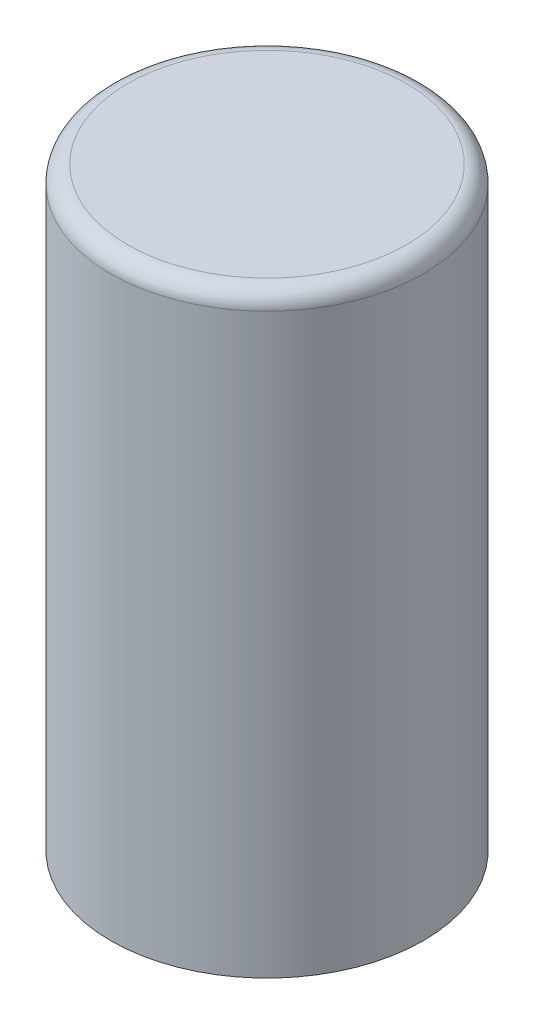
ISO-10303-21;
HEADER;
FILE_DESCRIPTION(('STEP AP214'),'2;1');
FILE_NAME('part.step','',(''),(''),'','','');
FILE_SCHEMA(('AUTOMOTIVE_DESIGN { 1 0 10303 214 1 1 1 1 }'));
ENDSEC;
DATA;
#1=APPLICATION_CONTEXT('core data for automotive mechanical design processes');
#2=APPLICATION_PROTOCOL_DEFINITION('international standard','automotive_design',2000,#1);
#3=PRODUCT_CONTEXT('',#1,'mechanical');
#4=PRODUCT('Part','Part','',(#3));
#5=PRODUCT_RELATED_PRODUCT_CATEGORY('part','',(#4));
#6=PRODUCT_DEFINITION_FORMATION('','',#4);
#7=PRODUCT_DEFINITION_CONTEXT('part definition',#1,'design');
#8=PRODUCT_DEFINITION('design','',#6,#7);
#9=PRODUCT_DEFINITION_SHAPE('','',#8);
#10=(LENGTH_UNIT() NAMED_UNIT(*) SI_UNIT(.MILLI.,.METRE.));
#11=(NAMED_UNIT(*) PLANE_ANGLE_UNIT() SI_UNIT($,.RADIAN.));
#12=(NAMED_UNIT(*) SI_UNIT($,.STERADIAN.) SOLID_ANGLE_UNIT());
#13=UNCERTAINTY_MEASURE_WITH_UNIT(LENGTH_MEASURE(1.E-05),#10,'distance_accuracy_value','');
#14=(GEOMETRIC_REPRESENTATION_CONTEXT(3) GLOBAL_UNCERTAINTY_ASSIGNED_CONTEXT((#13)) GLOBAL_UNIT_ASSIGNED_CONTEXT((#10,
#11,#12)) REPRESENTATION_CONTEXT('',''));
#15=CARTESIAN_POINT('',(0.,0.,0.));
#16=DIRECTION('',(0.,0.,1.));
#17=DIRECTION('',(1.,0.,0.));
#18=AXIS2_PLACEMENT_3D('',#15,#16,#17);
#19=CARTESIAN_POINT('',(0.,5.17144,0.));
#20=DIRECTION('',(0.,1.,0.));
#21=DIRECTION('',(0.,0.,1.));
#22=AXIS2_PLACEMENT_3D('',#19,#20,#21);
#23=PLANE('',#22);
#24=CARTESIAN_POINT('',(0.,5.17144,0.));
#25=DIRECTION('',(0.,1.,0.));
#26=DIRECTION('',(0.,0.,1.));
#27=AXIS2_PLACEMENT_3D('',#24,#25,#26);
#28=CIRCLE('',#27,1.0541);
#29=CARTESIAN_POINT('',(0.,5.17144,1.0541));
#30=VERTEX_POINT('',#29);
#31=EDGE_CURVE('E11',#30,#30,#28,.T.);
#32=ORIENTED_EDGE('',*,*,#31,.T.);
#33=EDGE_LOOP('',(#32));
#34=FACE_BOUND('',#33,.T.);
#35=ADVANCED_FACE('F38',(#34),#23,.T.);
#36=CARTESIAN_POINT('',(0.,0.,0.));
#37=DIRECTION('',(0.,-1.,0.));
#38=DIRECTION('',(0.,0.,-1.));
#39=AXIS2_PLACEMENT_3D('',#36,#37,#38);
#40=CYLINDRICAL_SURFACE('',#39,1.1811);
#41=CARTESIAN_POINT('',(0.,5.04444,0.));
#42=DIRECTION('',(0.,1.,0.));
#43=DIRECTION('',(0.,0.,1.));
#44=AXIS2_PLACEMENT_3D('',#41,#42,#43);
#45=CIRCLE('',#44,1.1811);
#46=CARTESIAN_POINT('',(0.,5.04444,1.1811));
#47=VERTEX_POINT('',#46);
#48=EDGE_CURVE('E46',#47,#47,#45,.F.);
#49=ORIENTED_EDGE('',*,*,#48,.T.);
#50=EDGE_LOOP('',(#49));
#51=FACE_BOUND('',#50,.T.);
#52=CARTESIAN_POINT('',(0.,0.681908402939864,0.));
#53=DIRECTION('',(0.,-1.,0.));
#54=DIRECTION('',(0.,0.,-1.));
#55=AXIS2_PLACEMENT_3D('',#52,#53,#54);
#56=CIRCLE('',#55,1.1811);
#57=CARTESIAN_POINT('',(0.,0.681908402939864,-1.1811));
#58=VERTEX_POINT('',#57);
#59=EDGE_CURVE('E71',#58,#58,#56,.T.);
#60=ORIENTED_EDGE('',*,*,#59,.F.);
#61=EDGE_LOOP('',(#60));
#62=FACE_BOUND('',#61,.T.);
#63=ADVANCED_FACE('F51',(#51,#62),#40,.T.);
#64=CARTESIAN_POINT('',(0.,0.,0.));
#65=DIRECTION('',(0.,1.,0.));
#66=DIRECTION('',(0.,0.,1.));
#67=AXIS2_PLACEMENT_3D('',#64,#65,#66);
#68=CONICAL_SURFACE('',#67,0.,1.0471975511966);
#69=ORIENTED_EDGE('',*,*,#59,.T.);
#70=EDGE_LOOP('',(#69));
#71=FACE_BOUND('',#70,.T.);
#72=CARTESIAN_POINT('',(0.,0.,0.));
#73=VERTEX_POINT('',#72);
#74=VERTEX_LOOP('',#73);
#75=FACE_BOUND('',#74,.T.);
#76=ADVANCED_FACE('F49',(#71,#75),#68,.T.);
#77=CARTESIAN_POINT('',(0.,5.04444,0.));
#78=DIRECTION('',(0.,1.,0.));
#79=DIRECTION('',(0.,0.,1.));
#80=AXIS2_PLACEMENT_3D('',#77,#78,#79);
#81=TOROIDAL_SURFACE('',#80,1.0541,0.127);
#82=ORIENTED_EDGE('',*,*,#31,.F.);
#83=EDGE_LOOP('',(#82));
#84=FACE_BOUND('',#83,.T.);
#85=ORIENTED_EDGE('',*,*,#48,.F.);
#86=EDGE_LOOP('',(#85));
#87=FACE_BOUND('',#86,.T.);
#88=ADVANCED_FACE('F40',(#84,#87),#81,.T.);
#89=CLOSED_SHELL('',(#35,#63,#76,#88));
#90=MANIFOLD_SOLID_BREP('B2',#89);
#91=ADVANCED_BREP_SHAPE_REPRESENTATION('',(#18,#90),#14);
#92=SHAPE_DEFINITION_REPRESENTATION(#9,#91);
ENDSEC;
END-ISO-10303-21;
